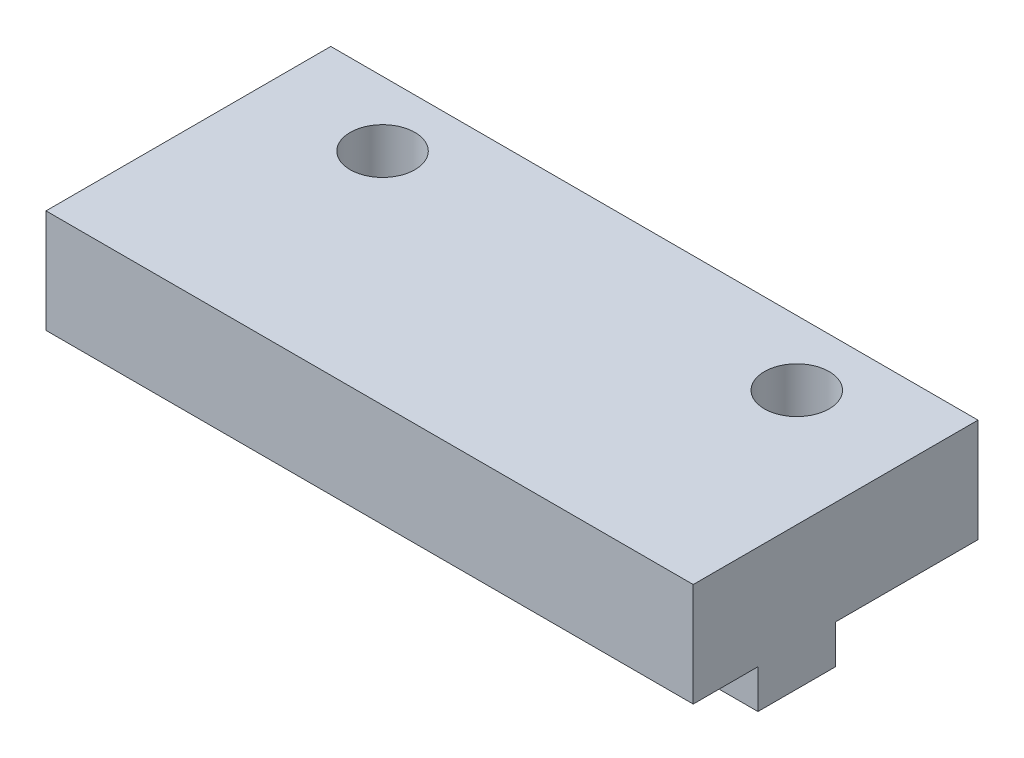
ISO-10303-21;
HEADER;
FILE_DESCRIPTION(('STEP AP214'),'2;1');
FILE_NAME('part.step','',(''),(''),'','','');
FILE_SCHEMA(('AUTOMOTIVE_DESIGN { 1 0 10303 214 1 1 1 1 }'));
ENDSEC;
DATA;
#1=APPLICATION_CONTEXT('core data for automotive mechanical design processes');
#2=APPLICATION_PROTOCOL_DEFINITION('international standard','automotive_design',2000,#1);
#3=PRODUCT_CONTEXT('',#1,'mechanical');
#4=PRODUCT('Part','Part','',(#3));
#5=PRODUCT_RELATED_PRODUCT_CATEGORY('part','',(#4));
#6=PRODUCT_DEFINITION_FORMATION('','',#4);
#7=PRODUCT_DEFINITION_CONTEXT('part definition',#1,'design');
#8=PRODUCT_DEFINITION('design','',#6,#7);
#9=PRODUCT_DEFINITION_SHAPE('','',#8);
#10=(LENGTH_UNIT() NAMED_UNIT(*) SI_UNIT(.MILLI.,.METRE.));
#11=(NAMED_UNIT(*) PLANE_ANGLE_UNIT() SI_UNIT($,.RADIAN.));
#12=(NAMED_UNIT(*) SI_UNIT($,.STERADIAN.) SOLID_ANGLE_UNIT());
#13=UNCERTAINTY_MEASURE_WITH_UNIT(LENGTH_MEASURE(1.E-05),#10,'distance_accuracy_value','');
#14=(GEOMETRIC_REPRESENTATION_CONTEXT(3) GLOBAL_UNCERTAINTY_ASSIGNED_CONTEXT((#13)) GLOBAL_UNIT_ASSIGNED_CONTEXT((#10,
#11,#12)) REPRESENTATION_CONTEXT('',''));
#15=CARTESIAN_POINT('',(0.,0.,0.));
#16=DIRECTION('',(0.,0.,1.));
#17=DIRECTION('',(1.,0.,0.));
#18=AXIS2_PLACEMENT_3D('',#15,#16,#17);
#19=CARTESIAN_POINT('',(0.,0.,0.));
#20=DIRECTION('',(0.,-1.,0.));
#21=DIRECTION('',(0.,0.,-1.));
#22=AXIS2_PLACEMENT_3D('',#19,#20,#21);
#23=PLANE('',#22);
#24=DIRECTION('',(-1.,0.,0.));
#25=VECTOR('',#24,1.);
#26=CARTESIAN_POINT('',(25.,0.,3.5));
#27=LINE('',#26,#25);
#28=CARTESIAN_POINT('',(25.,0.,3.5));
#29=VERTEX_POINT('',#28);
#30=CARTESIAN_POINT('',(0.,0.,3.5));
#31=VERTEX_POINT('',#30);
#32=EDGE_CURVE('E52',#29,#31,#27,.T.);
#33=ORIENTED_EDGE('',*,*,#32,.F.);
#34=DIRECTION('',(0.,0.,-1.));
#35=VECTOR('',#34,1.);
#36=CARTESIAN_POINT('',(25.,0.,0.));
#37=LINE('',#36,#35);
#38=CARTESIAN_POINT('',(25.,0.,6.));
#39=VERTEX_POINT('',#38);
#40=EDGE_CURVE('E158',#39,#29,#37,.T.);
#41=ORIENTED_EDGE('',*,*,#40,.F.);
#42=DIRECTION('',(1.,0.,0.));
#43=VECTOR('',#42,1.);
#44=CARTESIAN_POINT('',(0.,0.,6.));
#45=LINE('',#44,#43);
#46=CARTESIAN_POINT('',(0.,0.,6.));
#47=VERTEX_POINT('',#46);
#48=EDGE_CURVE('E125',#47,#39,#45,.T.);
#49=ORIENTED_EDGE('',*,*,#48,.F.);
#50=DIRECTION('',(0.,0.,1.));
#51=VECTOR('',#50,1.);
#52=CARTESIAN_POINT('',(0.,0.,0.));
#53=LINE('',#52,#51);
#54=EDGE_CURVE('E57',#31,#47,#53,.T.);
#55=ORIENTED_EDGE('',*,*,#54,.F.);
#56=EDGE_LOOP('',(#33,#41,#49,#55));
#57=FACE_BOUND('',#56,.T.);
#58=ADVANCED_FACE('F35',(#57),#23,.T.);
#59=CARTESIAN_POINT('',(0.,4.,0.));
#60=DIRECTION('',(0.,-1.,0.));
#61=DIRECTION('',(0.,0.,-1.));
#62=AXIS2_PLACEMENT_3D('',#59,#60,#61);
#63=PLANE('',#62);
#64=DIRECTION('',(0.,0.,1.));
#65=VECTOR('',#64,1.);
#66=CARTESIAN_POINT('',(0.,4.,0.));
#67=LINE('',#66,#65);
#68=CARTESIAN_POINT('',(0.,4.,-5.));
#69=VERTEX_POINT('',#68);
#70=CARTESIAN_POINT('',(0.,4.,6.));
#71=VERTEX_POINT('',#70);
#72=EDGE_CURVE('E163',#69,#71,#67,.T.);
#73=ORIENTED_EDGE('',*,*,#72,.T.);
#74=DIRECTION('',(-1.,0.,0.));
#75=VECTOR('',#74,1.);
#76=CARTESIAN_POINT('',(25.,4.,6.));
#77=LINE('',#76,#75);
#78=CARTESIAN_POINT('',(25.,4.,6.));
#79=VERTEX_POINT('',#78);
#80=EDGE_CURVE('E207',#79,#71,#77,.T.);
#81=ORIENTED_EDGE('',*,*,#80,.F.);
#82=DIRECTION('',(0.,0.,-1.));
#83=VECTOR('',#82,1.);
#84=CARTESIAN_POINT('',(25.,4.,0.));
#85=LINE('',#84,#83);
#86=CARTESIAN_POINT('',(25.,4.,-5.));
#87=VERTEX_POINT('',#86);
#88=EDGE_CURVE('E192',#79,#87,#85,.T.);
#89=ORIENTED_EDGE('',*,*,#88,.T.);
#90=DIRECTION('',(-1.,0.,0.));
#91=VECTOR('',#90,1.);
#92=CARTESIAN_POINT('',(0.,4.,-5.));
#93=LINE('',#92,#91);
#94=EDGE_CURVE('E175',#87,#69,#93,.T.);
#95=ORIENTED_EDGE('',*,*,#94,.T.);
#96=EDGE_LOOP('',(#73,#81,#89,#95));
#97=FACE_BOUND('',#96,.T.);
#98=CARTESIAN_POINT('',(4.5,4.,-2.5));
#99=DIRECTION('',(0.,1.,0.));
#100=DIRECTION('',(0.,0.,1.));
#101=AXIS2_PLACEMENT_3D('',#98,#99,#100);
#102=CIRCLE('',#101,1.25);
#103=CARTESIAN_POINT('',(4.5,4.,-1.25));
#104=VERTEX_POINT('',#103);
#105=EDGE_CURVE('E177',#104,#104,#102,.T.);
#106=ORIENTED_EDGE('',*,*,#105,.F.);
#107=EDGE_LOOP('',(#106));
#108=FACE_BOUND('',#107,.T.);
#109=CARTESIAN_POINT('',(20.5,4.,-2.5));
#110=DIRECTION('',(0.,1.,0.));
#111=DIRECTION('',(0.,0.,1.));
#112=AXIS2_PLACEMENT_3D('',#109,#110,#111);
#113=CIRCLE('',#112,1.25);
#114=CARTESIAN_POINT('',(20.5,4.,-1.25));
#115=VERTEX_POINT('',#114);
#116=EDGE_CURVE('E185',#115,#115,#113,.T.);
#117=ORIENTED_EDGE('',*,*,#116,.F.);
#118=EDGE_LOOP('',(#117));
#119=FACE_BOUND('',#118,.T.);
#120=ADVANCED_FACE('F196',(#97,#108,#119),#63,.F.);
#121=DIRECTION('',(1.,0.,0.));
#122=VECTOR('',#121,1.);
#123=CARTESIAN_POINT('',(25.,0.,0.5));
#124=LINE('',#123,#122);
#125=CARTESIAN_POINT('',(0.,0.,0.499999999999998));
#126=VERTEX_POINT('',#125);
#127=CARTESIAN_POINT('',(25.,0.,0.5));
#128=VERTEX_POINT('',#127);
#129=EDGE_CURVE('E119',#126,#128,#124,.T.);
#130=ORIENTED_EDGE('',*,*,#129,.F.);
#131=CARTESIAN_POINT('',(0.,0.,-5.));
#132=VERTEX_POINT('',#131);
#133=EDGE_CURVE('E165',#132,#126,#53,.T.);
#134=ORIENTED_EDGE('',*,*,#133,.F.);
#135=DIRECTION('',(-1.,0.,0.));
#136=VECTOR('',#135,1.);
#137=CARTESIAN_POINT('',(0.,0.,-5.));
#138=LINE('',#137,#136);
#139=CARTESIAN_POINT('',(25.,0.,-5.));
#140=VERTEX_POINT('',#139);
#141=EDGE_CURVE('E162',#140,#132,#138,.T.);
#142=ORIENTED_EDGE('',*,*,#141,.F.);
#143=EDGE_CURVE('E146',#128,#140,#37,.T.);
#144=ORIENTED_EDGE('',*,*,#143,.F.);
#145=EDGE_LOOP('',(#130,#134,#142,#144));
#146=FACE_BOUND('',#145,.T.);
#147=CARTESIAN_POINT('',(4.5,0.,-2.5));
#148=DIRECTION('',(0.,1.,0.));
#149=DIRECTION('',(0.,0.,1.));
#150=AXIS2_PLACEMENT_3D('',#147,#148,#149);
#151=CIRCLE('',#150,1.25);
#152=CARTESIAN_POINT('',(4.5,0.,-1.25));
#153=VERTEX_POINT('',#152);
#154=EDGE_CURVE('E180',#153,#153,#151,.T.);
#155=ORIENTED_EDGE('',*,*,#154,.T.);
#156=EDGE_LOOP('',(#155));
#157=FACE_BOUND('',#156,.T.);
#158=CARTESIAN_POINT('',(20.5,0.,-2.5));
#159=DIRECTION('',(0.,1.,0.));
#160=DIRECTION('',(0.,0.,1.));
#161=AXIS2_PLACEMENT_3D('',#158,#159,#160);
#162=CIRCLE('',#161,1.25);
#163=CARTESIAN_POINT('',(20.5,0.,-1.25));
#164=VERTEX_POINT('',#163);
#165=EDGE_CURVE('E188',#164,#164,#162,.T.);
#166=ORIENTED_EDGE('',*,*,#165,.T.);
#167=EDGE_LOOP('',(#166));
#168=FACE_BOUND('',#167,.T.);
#169=ADVANCED_FACE('F218',(#146,#157,#168),#23,.T.);
#170=CARTESIAN_POINT('',(0.,4.,0.));
#171=DIRECTION('',(1.,0.,0.));
#172=DIRECTION('',(0.,0.,-1.));
#173=AXIS2_PLACEMENT_3D('',#170,#171,#172);
#174=PLANE('',#173);
#175=ORIENTED_EDGE('',*,*,#133,.T.);
#176=DIRECTION('',(0.,1.,0.));
#177=VECTOR('',#176,1.);
#178=CARTESIAN_POINT('',(0.,-1.5,0.499999999999995));
#179=LINE('',#178,#177);
#180=CARTESIAN_POINT('',(0.,-1.5,0.499999999999995));
#181=VERTEX_POINT('',#180);
#182=EDGE_CURVE('E106',#181,#126,#179,.T.);
#183=ORIENTED_EDGE('',*,*,#182,.F.);
#184=DIRECTION('',(0.,0.,-1.));
#185=VECTOR('',#184,1.);
#186=CARTESIAN_POINT('',(0.,-1.5,3.5));
#187=LINE('',#186,#185);
#188=CARTESIAN_POINT('',(0.,-1.5,3.5));
#189=VERTEX_POINT('',#188);
#190=EDGE_CURVE('E100',#189,#181,#187,.T.);
#191=ORIENTED_EDGE('',*,*,#190,.F.);
#192=DIRECTION('',(0.,1.,0.));
#193=VECTOR('',#192,1.);
#194=CARTESIAN_POINT('',(0.,-1.5,3.5));
#195=LINE('',#194,#193);
#196=EDGE_CURVE('E104',#189,#31,#195,.T.);
#197=ORIENTED_EDGE('',*,*,#196,.T.);
#198=ORIENTED_EDGE('',*,*,#54,.T.);
#199=DIRECTION('',(0.,-1.,0.));
#200=VECTOR('',#199,1.);
#201=CARTESIAN_POINT('',(0.,4.,6.));
#202=LINE('',#201,#200);
#203=EDGE_CURVE('E122',#71,#47,#202,.T.);
#204=ORIENTED_EDGE('',*,*,#203,.F.);
#205=ORIENTED_EDGE('',*,*,#72,.F.);
#206=DIRECTION('',(0.,-1.,0.));
#207=VECTOR('',#206,1.);
#208=CARTESIAN_POINT('',(0.,4.,-5.));
#209=LINE('',#208,#207);
#210=EDGE_CURVE('E44',#69,#132,#209,.T.);
#211=ORIENTED_EDGE('',*,*,#210,.T.);
#212=EDGE_LOOP('',(#175,#183,#191,#197,#198,#204,#205,#211));
#213=FACE_BOUND('',#212,.T.);
#214=ADVANCED_FACE('F37',(#213),#174,.F.);
#215=CARTESIAN_POINT('',(25.,4.,0.));
#216=DIRECTION('',(-1.,0.,0.));
#217=DIRECTION('',(0.,0.,1.));
#218=AXIS2_PLACEMENT_3D('',#215,#216,#217);
#219=PLANE('',#218);
#220=ORIENTED_EDGE('',*,*,#40,.T.);
#221=DIRECTION('',(0.,1.,0.));
#222=VECTOR('',#221,1.);
#223=CARTESIAN_POINT('',(25.,-1.5,3.5));
#224=LINE('',#223,#222);
#225=CARTESIAN_POINT('',(25.,-1.5,3.5));
#226=VERTEX_POINT('',#225);
#227=EDGE_CURVE('E135',#226,#29,#224,.T.);
#228=ORIENTED_EDGE('',*,*,#227,.F.);
#229=DIRECTION('',(0.,0.,1.));
#230=VECTOR('',#229,1.);
#231=CARTESIAN_POINT('',(25.,-1.5,3.5));
#232=LINE('',#231,#230);
#233=CARTESIAN_POINT('',(25.,-1.5,0.5));
#234=VERTEX_POINT('',#233);
#235=EDGE_CURVE('E115',#234,#226,#232,.T.);
#236=ORIENTED_EDGE('',*,*,#235,.F.);
#237=DIRECTION('',(0.,1.,0.));
#238=VECTOR('',#237,1.);
#239=CARTESIAN_POINT('',(25.,-1.5,0.5));
#240=LINE('',#239,#238);
#241=EDGE_CURVE('E127',#234,#128,#240,.T.);
#242=ORIENTED_EDGE('',*,*,#241,.T.);
#243=ORIENTED_EDGE('',*,*,#143,.T.);
#244=DIRECTION('',(0.,-1.,0.));
#245=VECTOR('',#244,1.);
#246=CARTESIAN_POINT('',(25.,4.,-5.));
#247=LINE('',#246,#245);
#248=EDGE_CURVE('E11',#87,#140,#247,.T.);
#249=ORIENTED_EDGE('',*,*,#248,.F.);
#250=ORIENTED_EDGE('',*,*,#88,.F.);
#251=DIRECTION('',(0.,1.,0.));
#252=VECTOR('',#251,1.);
#253=CARTESIAN_POINT('',(25.,0.,6.));
#254=LINE('',#253,#252);
#255=EDGE_CURVE('E160',#39,#79,#254,.T.);
#256=ORIENTED_EDGE('',*,*,#255,.F.);
#257=EDGE_LOOP('',(#220,#228,#236,#242,#243,#249,#250,#256));
#258=FACE_BOUND('',#257,.T.);
#259=ADVANCED_FACE('F156',(#258),#219,.F.);
#260=CARTESIAN_POINT('',(0.,4.,-5.));
#261=DIRECTION('',(0.,0.,1.));
#262=DIRECTION('',(1.,0.,0.));
#263=AXIS2_PLACEMENT_3D('',#260,#261,#262);
#264=PLANE('',#263);
#265=ORIENTED_EDGE('',*,*,#141,.T.);
#266=ORIENTED_EDGE('',*,*,#210,.F.);
#267=ORIENTED_EDGE('',*,*,#94,.F.);
#268=ORIENTED_EDGE('',*,*,#248,.T.);
#269=EDGE_LOOP('',(#265,#266,#267,#268));
#270=FACE_BOUND('',#269,.T.);
#271=ADVANCED_FACE('F203',(#270),#264,.F.);
#272=CARTESIAN_POINT('',(4.5,4.,-2.5));
#273=DIRECTION('',(0.,-1.,0.));
#274=DIRECTION('',(0.,0.,-1.));
#275=AXIS2_PLACEMENT_3D('',#272,#273,#274);
#276=CYLINDRICAL_SURFACE('',#275,1.25);
#277=ORIENTED_EDGE('',*,*,#105,.T.);
#278=EDGE_LOOP('',(#277));
#279=FACE_BOUND('',#278,.T.);
#280=ORIENTED_EDGE('',*,*,#154,.F.);
#281=EDGE_LOOP('',(#280));
#282=FACE_BOUND('',#281,.T.);
#283=ADVANCED_FACE('F229',(#279,#282),#276,.F.);
#284=CARTESIAN_POINT('',(20.5,4.,-2.5));
#285=DIRECTION('',(0.,-1.,0.));
#286=DIRECTION('',(0.,0.,-1.));
#287=AXIS2_PLACEMENT_3D('',#284,#285,#286);
#288=CYLINDRICAL_SURFACE('',#287,1.25);
#289=ORIENTED_EDGE('',*,*,#116,.T.);
#290=EDGE_LOOP('',(#289));
#291=FACE_BOUND('',#290,.T.);
#292=ORIENTED_EDGE('',*,*,#165,.F.);
#293=EDGE_LOOP('',(#292));
#294=FACE_BOUND('',#293,.T.);
#295=ADVANCED_FACE('F214',(#291,#294),#288,.F.);
#296=CARTESIAN_POINT('',(0.,0.,6.));
#297=DIRECTION('',(0.,0.,1.));
#298=DIRECTION('',(1.,0.,0.));
#299=AXIS2_PLACEMENT_3D('',#296,#297,#298);
#300=PLANE('',#299);
#301=ORIENTED_EDGE('',*,*,#203,.T.);
#302=ORIENTED_EDGE('',*,*,#48,.T.);
#303=ORIENTED_EDGE('',*,*,#255,.T.);
#304=ORIENTED_EDGE('',*,*,#80,.T.);
#305=EDGE_LOOP('',(#301,#302,#303,#304));
#306=FACE_BOUND('',#305,.T.);
#307=ADVANCED_FACE('F206',(#306),#300,.T.);
#308=CARTESIAN_POINT('',(25.,-1.5,3.5));
#309=DIRECTION('',(0.,0.,-1.));
#310=DIRECTION('',(-1.,0.,0.));
#311=AXIS2_PLACEMENT_3D('',#308,#309,#310);
#312=PLANE('',#311);
#313=ORIENTED_EDGE('',*,*,#32,.T.);
#314=ORIENTED_EDGE('',*,*,#196,.F.);
#315=DIRECTION('',(-1.,0.,0.));
#316=VECTOR('',#315,1.);
#317=CARTESIAN_POINT('',(25.,-1.5,3.5));
#318=LINE('',#317,#316);
#319=EDGE_CURVE('E110',#226,#189,#318,.T.);
#320=ORIENTED_EDGE('',*,*,#319,.F.);
#321=ORIENTED_EDGE('',*,*,#227,.T.);
#322=EDGE_LOOP('',(#313,#314,#320,#321));
#323=FACE_BOUND('',#322,.T.);
#324=ADVANCED_FACE('F121',(#323),#312,.F.);
#325=CARTESIAN_POINT('',(25.,-1.5,0.5));
#326=DIRECTION('',(0.,0.,1.));
#327=DIRECTION('',(1.,0.,0.));
#328=AXIS2_PLACEMENT_3D('',#325,#326,#327);
#329=PLANE('',#328);
#330=ORIENTED_EDGE('',*,*,#129,.T.);
#331=ORIENTED_EDGE('',*,*,#241,.F.);
#332=DIRECTION('',(1.,0.,0.));
#333=VECTOR('',#332,1.);
#334=CARTESIAN_POINT('',(25.,-1.5,0.5));
#335=LINE('',#334,#333);
#336=EDGE_CURVE('E109',#181,#234,#335,.T.);
#337=ORIENTED_EDGE('',*,*,#336,.F.);
#338=ORIENTED_EDGE('',*,*,#182,.T.);
#339=EDGE_LOOP('',(#330,#331,#337,#338));
#340=FACE_BOUND('',#339,.T.);
#341=ADVANCED_FACE('F155',(#340),#329,.F.);
#342=CARTESIAN_POINT('',(0.,-1.5,0.));
#343=DIRECTION('',(0.,-1.,0.));
#344=DIRECTION('',(0.,0.,-1.));
#345=AXIS2_PLACEMENT_3D('',#342,#343,#344);
#346=PLANE('',#345);
#347=ORIENTED_EDGE('',*,*,#319,.T.);
#348=ORIENTED_EDGE('',*,*,#190,.T.);
#349=ORIENTED_EDGE('',*,*,#336,.T.);
#350=ORIENTED_EDGE('',*,*,#235,.T.);
#351=EDGE_LOOP('',(#347,#348,#349,#350));
#352=FACE_BOUND('',#351,.T.);
#353=ADVANCED_FACE('F113',(#352),#346,.T.);
#354=CLOSED_SHELL('',(#58,#120,#169,#214,#259,#271,#283,#295,#307,#324,#341,#353));
#355=MANIFOLD_SOLID_BREP('B2',#354);
#356=ADVANCED_BREP_SHAPE_REPRESENTATION('',(#18,#355),#14);
#357=SHAPE_DEFINITION_REPRESENTATION(#9,#356);
ENDSEC;
END-ISO-10303-21;
